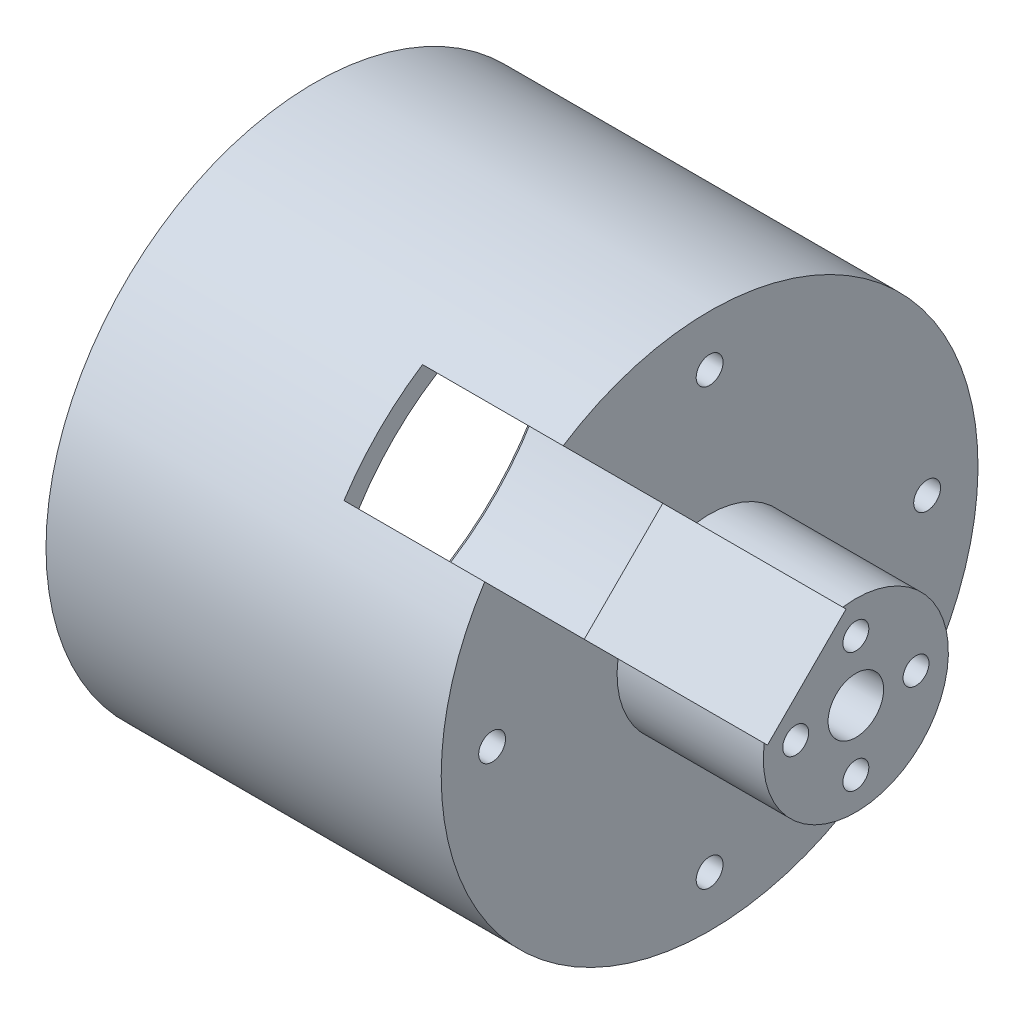
ISO-10303-21;
HEADER;
FILE_DESCRIPTION(('STEP AP214'),'2;1');
FILE_NAME('part.step','',(''),(''),'','','');
FILE_SCHEMA(('AUTOMOTIVE_DESIGN { 1 0 10303 214 1 1 1 1 }'));
ENDSEC;
DATA;
#1=APPLICATION_CONTEXT('core data for automotive mechanical design processes');
#2=APPLICATION_PROTOCOL_DEFINITION('international standard','automotive_design',2000,#1);
#3=PRODUCT_CONTEXT('',#1,'mechanical');
#4=PRODUCT('Part','Part','',(#3));
#5=PRODUCT_RELATED_PRODUCT_CATEGORY('part','',(#4));
#6=PRODUCT_DEFINITION_FORMATION('','',#4);
#7=PRODUCT_DEFINITION_CONTEXT('part definition',#1,'design');
#8=PRODUCT_DEFINITION('design','',#6,#7);
#9=PRODUCT_DEFINITION_SHAPE('','',#8);
#10=(LENGTH_UNIT() NAMED_UNIT(*) SI_UNIT(.MILLI.,.METRE.));
#11=(NAMED_UNIT(*) PLANE_ANGLE_UNIT() SI_UNIT($,.RADIAN.));
#12=(NAMED_UNIT(*) SI_UNIT($,.STERADIAN.) SOLID_ANGLE_UNIT());
#13=UNCERTAINTY_MEASURE_WITH_UNIT(LENGTH_MEASURE(1.E-05),#10,'distance_accuracy_value','');
#14=(GEOMETRIC_REPRESENTATION_CONTEXT(3) GLOBAL_UNCERTAINTY_ASSIGNED_CONTEXT((#13)) GLOBAL_UNIT_ASSIGNED_CONTEXT((#10,
#11,#12)) REPRESENTATION_CONTEXT('',''));
#15=CARTESIAN_POINT('',(0.,0.,0.));
#16=DIRECTION('',(0.,0.,1.));
#17=DIRECTION('',(1.,0.,0.));
#18=AXIS2_PLACEMENT_3D('',#15,#16,#17);
#19=CARTESIAN_POINT('',(-10.123,0.,0.));
#20=DIRECTION('',(-1.,0.,0.));
#21=DIRECTION('',(0.,0.,1.));
#22=AXIS2_PLACEMENT_3D('',#19,#20,#21);
#23=CYLINDRICAL_SURFACE('',#22,26.8);
#24=CARTESIAN_POINT('',(-21.,0.,0.));
#25=DIRECTION('',(1.,0.,0.));
#26=DIRECTION('',(0.,0.,-1.));
#27=AXIS2_PLACEMENT_3D('',#24,#25,#26);
#28=CIRCLE('',#27,26.8);
#29=CARTESIAN_POINT('',(-21.,0.,-26.8));
#30=VERTEX_POINT('',#29);
#31=EDGE_CURVE('E47',#30,#30,#28,.F.);
#32=ORIENTED_EDGE('',*,*,#31,.T.);
#33=EDGE_LOOP('',(#32));
#34=FACE_BOUND('',#33,.T.);
#35=DIRECTION('',(-1.,0.,0.));
#36=VECTOR('',#35,1.);
#37=CARTESIAN_POINT('',(-10.123,22.7120748961036,14.226793521865));
#38=LINE('',#37,#36);
#39=CARTESIAN_POINT('',(6.,22.7120748961036,14.226793521865));
#40=VERTEX_POINT('',#39);
#41=CARTESIAN_POINT('',(17.2,22.7120748961036,14.226793521865));
#42=VERTEX_POINT('',#41);
#43=EDGE_CURVE('E126',#40,#42,#38,.F.);
#44=ORIENTED_EDGE('',*,*,#43,.F.);
#45=CARTESIAN_POINT('',(6.,0.,0.));
#46=DIRECTION('',(-1.,0.,0.));
#47=DIRECTION('',(0.,0.,1.));
#48=AXIS2_PLACEMENT_3D('',#45,#46,#47);
#49=CIRCLE('',#48,26.8);
#50=CARTESIAN_POINT('',(6.,14.226793521865,22.7120748961036));
#51=VERTEX_POINT('',#50);
#52=EDGE_CURVE('E143',#40,#51,#49,.F.);
#53=ORIENTED_EDGE('',*,*,#52,.T.);
#54=DIRECTION('',(-1.,0.,0.));
#55=VECTOR('',#54,1.);
#56=CARTESIAN_POINT('',(-10.123,14.226793521865,22.7120748961036));
#57=LINE('',#56,#55);
#58=CARTESIAN_POINT('',(17.2,14.226793521865,22.7120748961036));
#59=VERTEX_POINT('',#58);
#60=EDGE_CURVE('E120',#59,#51,#57,.T.);
#61=ORIENTED_EDGE('',*,*,#60,.F.);
#62=CARTESIAN_POINT('',(17.2,0.,0.));
#63=DIRECTION('',(-1.,0.,0.));
#64=DIRECTION('',(0.,0.,1.));
#65=AXIS2_PLACEMENT_3D('',#62,#63,#64);
#66=CIRCLE('',#65,26.8);
#67=EDGE_CURVE('E191',#42,#59,#66,.T.);
#68=ORIENTED_EDGE('',*,*,#67,.F.);
#69=EDGE_LOOP('',(#44,#53,#61,#68));
#70=FACE_BOUND('',#69,.T.);
#71=ADVANCED_FACE('F38',(#34,#70),#23,.F.);
#72=CARTESIAN_POINT('',(-10.123,0.,0.));
#73=DIRECTION('',(-1.,0.,0.));
#74=DIRECTION('',(0.,0.,1.));
#75=AXIS2_PLACEMENT_3D('',#72,#73,#74);
#76=CYLINDRICAL_SURFACE('',#75,29.);
#77=CARTESIAN_POINT('',(-21.5,0.,0.));
#78=DIRECTION('',(-1.,0.,0.));
#79=DIRECTION('',(0.,0.,1.));
#80=AXIS2_PLACEMENT_3D('',#77,#78,#79);
#81=CIRCLE('',#80,29.);
#82=CARTESIAN_POINT('',(-21.5,0.,29.));
#83=VERTEX_POINT('',#82);
#84=EDGE_CURVE('E209',#83,#83,#81,.T.);
#85=ORIENTED_EDGE('',*,*,#84,.F.);
#86=EDGE_LOOP('',(#85));
#87=FACE_BOUND('',#86,.T.);
#88=DIRECTION('',(-1.,0.,0.));
#89=VECTOR('',#88,1.);
#90=CARTESIAN_POINT('',(-10.123,24.3050433348582,15.8197619606196));
#91=LINE('',#90,#89);
#92=CARTESIAN_POINT('',(21.2,24.3050433348582,15.8197619606196));
#93=VERTEX_POINT('',#92);
#94=CARTESIAN_POINT('',(6.,24.3050433348582,15.8197619606196));
#95=VERTEX_POINT('',#94);
#96=EDGE_CURVE('E139',#93,#95,#91,.T.);
#97=ORIENTED_EDGE('',*,*,#96,.F.);
#98=CARTESIAN_POINT('',(21.2,0.,0.));
#99=DIRECTION('',(-1.,0.,0.));
#100=DIRECTION('',(0.,0.,1.));
#101=AXIS2_PLACEMENT_3D('',#98,#99,#100);
#102=CIRCLE('',#101,29.);
#103=CARTESIAN_POINT('',(21.2,15.8197619606196,24.3050433348582));
#104=VERTEX_POINT('',#103);
#105=EDGE_CURVE('E125',#93,#104,#102,.T.);
#106=ORIENTED_EDGE('',*,*,#105,.T.);
#107=DIRECTION('',(-1.,0.,0.));
#108=VECTOR('',#107,1.);
#109=CARTESIAN_POINT('',(-10.123,15.8197619606196,24.3050433348582));
#110=LINE('',#109,#108);
#111=CARTESIAN_POINT('',(6.,15.8197619606196,24.3050433348582));
#112=VERTEX_POINT('',#111);
#113=EDGE_CURVE('E117',#112,#104,#110,.F.);
#114=ORIENTED_EDGE('',*,*,#113,.F.);
#115=CARTESIAN_POINT('',(6.,0.,0.));
#116=DIRECTION('',(-1.,0.,0.));
#117=DIRECTION('',(0.,0.,1.));
#118=AXIS2_PLACEMENT_3D('',#115,#116,#117);
#119=CIRCLE('',#118,29.);
#120=EDGE_CURVE('E104',#112,#95,#119,.T.);
#121=ORIENTED_EDGE('',*,*,#120,.T.);
#122=EDGE_LOOP('',(#97,#106,#114,#121));
#123=FACE_BOUND('',#122,.T.);
#124=ADVANCED_FACE('F123',(#87,#123),#76,.T.);
#125=CARTESIAN_POINT('',(21.2,29.,0.));
#126=DIRECTION('',(-1.,0.,0.));
#127=DIRECTION('',(0.,0.,1.));
#128=AXIS2_PLACEMENT_3D('',#125,#126,#127);
#129=PLANE('',#128);
#130=CARTESIAN_POINT('',(21.2,0.,23.5));
#131=DIRECTION('',(1.,0.,0.));
#132=DIRECTION('',(0.,0.,-1.));
#133=AXIS2_PLACEMENT_3D('',#130,#131,#132);
#134=CIRCLE('',#133,1.45);
#135=CARTESIAN_POINT('',(21.2,0.,22.05));
#136=VERTEX_POINT('',#135);
#137=EDGE_CURVE('E173',#136,#136,#134,.T.);
#138=ORIENTED_EDGE('',*,*,#137,.F.);
#139=EDGE_LOOP('',(#138));
#140=FACE_BOUND('',#139,.T.);
#141=CARTESIAN_POINT('',(21.2,23.5,3.33955085807247E-13));
#142=DIRECTION('',(1.,0.,0.));
#143=DIRECTION('',(0.,-1.,0.));
#144=AXIS2_PLACEMENT_3D('',#141,#142,#143);
#145=CIRCLE('',#144,1.45);
#146=CARTESIAN_POINT('',(21.2,22.05,3.18767141983279E-13));
#147=VERTEX_POINT('',#146);
#148=EDGE_CURVE('E167',#147,#147,#145,.T.);
#149=ORIENTED_EDGE('',*,*,#148,.F.);
#150=EDGE_LOOP('',(#149));
#151=FACE_BOUND('',#150,.T.);
#152=CARTESIAN_POINT('',(21.2,0.,-23.5));
#153=DIRECTION('',(1.,0.,0.));
#154=DIRECTION('',(0.,0.,1.));
#155=AXIS2_PLACEMENT_3D('',#152,#153,#154);
#156=CIRCLE('',#155,1.45);
#157=CARTESIAN_POINT('',(21.2,0.,-22.05));
#158=VERTEX_POINT('',#157);
#159=EDGE_CURVE('E180',#158,#158,#156,.T.);
#160=ORIENTED_EDGE('',*,*,#159,.F.);
#161=EDGE_LOOP('',(#160));
#162=FACE_BOUND('',#161,.T.);
#163=CARTESIAN_POINT('',(21.2,-23.5,-1.6985546288162E-13));
#164=DIRECTION('',(1.,0.,0.));
#165=DIRECTION('',(0.,1.,0.));
#166=AXIS2_PLACEMENT_3D('',#163,#164,#165);
#167=CIRCLE('',#166,1.45);
#168=CARTESIAN_POINT('',(21.2,-22.05,-1.64792814940297E-13));
#169=VERTEX_POINT('',#168);
#170=EDGE_CURVE('E174',#169,#169,#167,.T.);
#171=ORIENTED_EDGE('',*,*,#170,.F.);
#172=EDGE_LOOP('',(#171));
#173=FACE_BOUND('',#172,.T.);
#174=DIRECTION('',(0.,0.707106781186548,0.707106781186548));
#175=VECTOR('',#174,1.);
#176=CARTESIAN_POINT('',(21.2,18.7426406871193,10.2573593128807));
#177=LINE('',#176,#175);
#178=CARTESIAN_POINT('',(21.2,9.89949493661167,1.4142135623731));
#179=VERTEX_POINT('',#178);
#180=EDGE_CURVE('E137',#179,#93,#177,.T.);
#181=ORIENTED_EDGE('',*,*,#180,.F.);
#182=CARTESIAN_POINT('',(21.2,0.,0.));
#183=DIRECTION('',(-1.,0.,0.));
#184=DIRECTION('',(0.,0.,1.));
#185=AXIS2_PLACEMENT_3D('',#182,#183,#184);
#186=CIRCLE('',#185,10.);
#187=CARTESIAN_POINT('',(21.2,1.41421356237309,9.89949493661167));
#188=VERTEX_POINT('',#187);
#189=EDGE_CURVE('E205',#179,#188,#186,.T.);
#190=ORIENTED_EDGE('',*,*,#189,.T.);
#191=DIRECTION('',(0.,-0.707106781186548,-0.707106781186547));
#192=VECTOR('',#191,1.);
#193=CARTESIAN_POINT('',(21.2,10.2573593128807,18.7426406871193));
#194=LINE('',#193,#192);
#195=EDGE_CURVE('E127',#104,#188,#194,.T.);
#196=ORIENTED_EDGE('',*,*,#195,.F.);
#197=ORIENTED_EDGE('',*,*,#105,.F.);
#198=EDGE_LOOP('',(#181,#190,#196,#197));
#199=FACE_BOUND('',#198,.T.);
#200=ADVANCED_FACE('F233',(#140,#151,#162,#173,#199),#129,.F.);
#201=CARTESIAN_POINT('',(-10.123,0.,0.));
#202=DIRECTION('',(-1.,0.,0.));
#203=DIRECTION('',(0.,0.,1.));
#204=AXIS2_PLACEMENT_3D('',#201,#202,#203);
#205=CYLINDRICAL_SURFACE('',#204,10.);
#206=DIRECTION('',(-1.,0.,0.));
#207=VECTOR('',#206,1.);
#208=CARTESIAN_POINT('',(-10.123,9.89949493661167,1.4142135623731));
#209=LINE('',#208,#207);
#210=CARTESIAN_POINT('',(37.,9.89949493661167,1.4142135623731));
#211=VERTEX_POINT('',#210);
#212=EDGE_CURVE('E135',#211,#179,#209,.T.);
#213=ORIENTED_EDGE('',*,*,#212,.F.);
#214=CARTESIAN_POINT('',(37.,0.,0.));
#215=DIRECTION('',(-1.,0.,0.));
#216=DIRECTION('',(0.,0.,1.));
#217=AXIS2_PLACEMENT_3D('',#214,#215,#216);
#218=CIRCLE('',#217,10.);
#219=CARTESIAN_POINT('',(37.,1.41421356237309,9.89949493661167));
#220=VERTEX_POINT('',#219);
#221=EDGE_CURVE('E202',#211,#220,#218,.T.);
#222=ORIENTED_EDGE('',*,*,#221,.T.);
#223=DIRECTION('',(-1.,0.,0.));
#224=VECTOR('',#223,1.);
#225=CARTESIAN_POINT('',(-10.123,1.41421356237309,9.89949493661167));
#226=LINE('',#225,#224);
#227=EDGE_CURVE('E54',#188,#220,#226,.F.);
#228=ORIENTED_EDGE('',*,*,#227,.F.);
#229=ORIENTED_EDGE('',*,*,#189,.F.);
#230=EDGE_LOOP('',(#213,#222,#228,#229));
#231=FACE_BOUND('',#230,.T.);
#232=ADVANCED_FACE('F245',(#231),#205,.T.);
#233=CARTESIAN_POINT('',(37.,10.,0.));
#234=DIRECTION('',(-1.,0.,0.));
#235=DIRECTION('',(0.,0.,1.));
#236=AXIS2_PLACEMENT_3D('',#233,#234,#235);
#237=PLANE('',#236);
#238=CARTESIAN_POINT('',(37.,0.,0.));
#239=DIRECTION('',(-1.,0.,0.));
#240=DIRECTION('',(0.,0.,1.));
#241=AXIS2_PLACEMENT_3D('',#238,#239,#240);
#242=CIRCLE('',#241,3.);
#243=CARTESIAN_POINT('',(37.,0.,3.));
#244=VERTEX_POINT('',#243);
#245=EDGE_CURVE('E199',#244,#244,#242,.T.);
#246=ORIENTED_EDGE('',*,*,#245,.T.);
#247=EDGE_LOOP('',(#246));
#248=FACE_BOUND('',#247,.T.);
#249=CARTESIAN_POINT('',(37.,0.,6.5));
#250=DIRECTION('',(1.,0.,0.));
#251=DIRECTION('',(0.,0.,-1.));
#252=AXIS2_PLACEMENT_3D('',#249,#250,#251);
#253=CIRCLE('',#252,1.4);
#254=CARTESIAN_POINT('',(37.,0.,5.1));
#255=VERTEX_POINT('',#254);
#256=EDGE_CURVE('E149',#255,#255,#253,.T.);
#257=ORIENTED_EDGE('',*,*,#256,.F.);
#258=EDGE_LOOP('',(#257));
#259=FACE_BOUND('',#258,.T.);
#260=CARTESIAN_POINT('',(37.,6.5,0.));
#261=DIRECTION('',(1.,0.,0.));
#262=DIRECTION('',(0.,-1.,0.));
#263=AXIS2_PLACEMENT_3D('',#260,#261,#262);
#264=CIRCLE('',#263,1.4);
#265=CARTESIAN_POINT('',(37.,5.1,0.));
#266=VERTEX_POINT('',#265);
#267=EDGE_CURVE('E145',#266,#266,#264,.T.);
#268=ORIENTED_EDGE('',*,*,#267,.F.);
#269=EDGE_LOOP('',(#268));
#270=FACE_BOUND('',#269,.T.);
#271=CARTESIAN_POINT('',(37.,0.,-6.5));
#272=DIRECTION('',(1.,0.,0.));
#273=DIRECTION('',(0.,0.,1.));
#274=AXIS2_PLACEMENT_3D('',#271,#272,#273);
#275=CIRCLE('',#274,1.4);
#276=CARTESIAN_POINT('',(37.,0.,-5.1));
#277=VERTEX_POINT('',#276);
#278=EDGE_CURVE('E156',#277,#277,#275,.T.);
#279=ORIENTED_EDGE('',*,*,#278,.F.);
#280=EDGE_LOOP('',(#279));
#281=FACE_BOUND('',#280,.T.);
#282=CARTESIAN_POINT('',(37.,-6.5,0.));
#283=DIRECTION('',(1.,0.,0.));
#284=DIRECTION('',(0.,1.,0.));
#285=AXIS2_PLACEMENT_3D('',#282,#283,#284);
#286=CIRCLE('',#285,1.4);
#287=CARTESIAN_POINT('',(37.,-5.1,0.));
#288=VERTEX_POINT('',#287);
#289=EDGE_CURVE('E150',#288,#288,#286,.T.);
#290=ORIENTED_EDGE('',*,*,#289,.F.);
#291=EDGE_LOOP('',(#290));
#292=FACE_BOUND('',#291,.T.);
#293=DIRECTION('',(0.,0.707106781186548,0.707106781186548));
#294=VECTOR('',#293,1.);
#295=CARTESIAN_POINT('',(37.,9.24264068711928,0.757359312880718));
#296=LINE('',#295,#294);
#297=CARTESIAN_POINT('',(37.,9.54594154601839,1.06066017177982));
#298=VERTEX_POINT('',#297);
#299=EDGE_CURVE('E129',#298,#211,#296,.T.);
#300=ORIENTED_EDGE('',*,*,#299,.F.);
#301=DIRECTION('',(0.,0.707106781186548,-0.707106781186548));
#302=VECTOR('',#301,1.);
#303=CARTESIAN_POINT('',(37.,10.3033008588991,0.303300858899107));
#304=LINE('',#303,#302);
#305=CARTESIAN_POINT('',(37.,1.06066017177982,9.54594154601839));
#306=VERTEX_POINT('',#305);
#307=EDGE_CURVE('E141',#306,#298,#304,.T.);
#308=ORIENTED_EDGE('',*,*,#307,.F.);
#309=DIRECTION('',(0.,-0.707106781186548,-0.707106781186547));
#310=VECTOR('',#309,1.);
#311=CARTESIAN_POINT('',(37.,0.757359312880715,9.24264068711929));
#312=LINE('',#311,#310);
#313=EDGE_CURVE('E518',#220,#306,#312,.T.);
#314=ORIENTED_EDGE('',*,*,#313,.F.);
#315=ORIENTED_EDGE('',*,*,#221,.F.);
#316=EDGE_LOOP('',(#300,#308,#314,#315));
#317=FACE_BOUND('',#316,.T.);
#318=ADVANCED_FACE('F249',(#248,#259,#270,#281,#292,#317),#237,.F.);
#319=CARTESIAN_POINT('',(17.2,3.,0.));
#320=DIRECTION('',(1.,0.,0.));
#321=DIRECTION('',(0.,0.,-1.));
#322=AXIS2_PLACEMENT_3D('',#319,#320,#321);
#323=PLANE('',#322);
#324=CARTESIAN_POINT('',(17.2,0.,0.));
#325=DIRECTION('',(-1.,0.,0.));
#326=DIRECTION('',(0.,0.,1.));
#327=AXIS2_PLACEMENT_3D('',#324,#325,#326);
#328=CIRCLE('',#327,3.);
#329=CARTESIAN_POINT('',(17.2,0.,3.));
#330=VERTEX_POINT('',#329);
#331=EDGE_CURVE('E196',#330,#330,#328,.T.);
#332=ORIENTED_EDGE('',*,*,#331,.F.);
#333=EDGE_LOOP('',(#332));
#334=FACE_BOUND('',#333,.T.);
#335=CARTESIAN_POINT('',(17.2,0.,23.5));
#336=DIRECTION('',(1.,0.,0.));
#337=DIRECTION('',(0.,0.,-1.));
#338=AXIS2_PLACEMENT_3D('',#335,#336,#337);
#339=CIRCLE('',#338,1.45);
#340=CARTESIAN_POINT('',(17.2,0.,22.05));
#341=VERTEX_POINT('',#340);
#342=EDGE_CURVE('E188',#341,#341,#339,.T.);
#343=ORIENTED_EDGE('',*,*,#342,.T.);
#344=EDGE_LOOP('',(#343));
#345=FACE_BOUND('',#344,.T.);
#346=CARTESIAN_POINT('',(17.2,23.5,3.33955085807247E-13));
#347=DIRECTION('',(1.,0.,0.));
#348=DIRECTION('',(0.,-1.,0.));
#349=AXIS2_PLACEMENT_3D('',#346,#347,#348);
#350=CIRCLE('',#349,1.45);
#351=CARTESIAN_POINT('',(17.2,22.05,3.18767141983279E-13));
#352=VERTEX_POINT('',#351);
#353=EDGE_CURVE('E183',#352,#352,#350,.T.);
#354=ORIENTED_EDGE('',*,*,#353,.T.);
#355=EDGE_LOOP('',(#354));
#356=FACE_BOUND('',#355,.T.);
#357=CARTESIAN_POINT('',(17.2,0.,-23.5));
#358=DIRECTION('',(1.,0.,0.));
#359=DIRECTION('',(0.,0.,1.));
#360=AXIS2_PLACEMENT_3D('',#357,#358,#359);
#361=CIRCLE('',#360,1.45);
#362=CARTESIAN_POINT('',(17.2,0.,-22.05));
#363=VERTEX_POINT('',#362);
#364=EDGE_CURVE('E177',#363,#363,#361,.T.);
#365=ORIENTED_EDGE('',*,*,#364,.T.);
#366=EDGE_LOOP('',(#365));
#367=FACE_BOUND('',#366,.T.);
#368=CARTESIAN_POINT('',(17.2,-23.5,-1.6985546288162E-13));
#369=DIRECTION('',(1.,0.,0.));
#370=DIRECTION('',(0.,1.,0.));
#371=AXIS2_PLACEMENT_3D('',#368,#369,#370);
#372=CIRCLE('',#371,1.45);
#373=CARTESIAN_POINT('',(17.2,-22.05,-1.64792814940297E-13));
#374=VERTEX_POINT('',#373);
#375=EDGE_CURVE('E170',#374,#374,#372,.T.);
#376=ORIENTED_EDGE('',*,*,#375,.T.);
#377=EDGE_LOOP('',(#376));
#378=FACE_BOUND('',#377,.T.);
#379=DIRECTION('',(0.,-0.707106781186548,-0.707106781186548));
#380=VECTOR('',#379,1.);
#381=CARTESIAN_POINT('',(17.2,5.74264068711928,-2.74264068711928));
#382=LINE('',#381,#380);
#383=CARTESIAN_POINT('',(17.2,9.54594154601839,1.06066017177982));
#384=VERTEX_POINT('',#383);
#385=EDGE_CURVE('E114',#42,#384,#382,.T.);
#386=ORIENTED_EDGE('',*,*,#385,.F.);
#387=ORIENTED_EDGE('',*,*,#67,.T.);
#388=DIRECTION('',(0.,0.707106781186548,0.707106781186547));
#389=VECTOR('',#388,1.);
#390=CARTESIAN_POINT('',(17.2,-2.74264068711929,5.74264068711929));
#391=LINE('',#390,#389);
#392=CARTESIAN_POINT('',(17.2,1.06066017177982,9.54594154601839));
#393=VERTEX_POINT('',#392);
#394=EDGE_CURVE('E212',#393,#59,#391,.T.);
#395=ORIENTED_EDGE('',*,*,#394,.F.);
#396=DIRECTION('',(0.,-0.707106781186548,0.707106781186548));
#397=VECTOR('',#396,1.);
#398=CARTESIAN_POINT('',(17.2,6.80330085889911,3.80330085889911));
#399=LINE('',#398,#397);
#400=EDGE_CURVE('E214',#384,#393,#399,.T.);
#401=ORIENTED_EDGE('',*,*,#400,.F.);
#402=EDGE_LOOP('',(#386,#387,#395,#401));
#403=FACE_BOUND('',#402,.T.);
#404=ADVANCED_FACE('F240',(#334,#345,#356,#367,#378,#403),#323,.F.);
#405=CARTESIAN_POINT('',(-21.5,26.8,0.));
#406=DIRECTION('',(1.,0.,0.));
#407=DIRECTION('',(0.,0.,-1.));
#408=AXIS2_PLACEMENT_3D('',#405,#406,#407);
#409=PLANE('',#408);
#410=CARTESIAN_POINT('',(-21.5,0.,0.));
#411=DIRECTION('',(1.,0.,0.));
#412=DIRECTION('',(0.,0.,-1.));
#413=AXIS2_PLACEMENT_3D('',#410,#411,#412);
#414=CIRCLE('',#413,27.3);
#415=CARTESIAN_POINT('',(-21.5,0.,-27.3));
#416=VERTEX_POINT('',#415);
#417=EDGE_CURVE('E11',#416,#416,#414,.T.);
#418=ORIENTED_EDGE('',*,*,#417,.T.);
#419=EDGE_LOOP('',(#418));
#420=FACE_BOUND('',#419,.T.);
#421=ORIENTED_EDGE('',*,*,#84,.T.);
#422=EDGE_LOOP('',(#421));
#423=FACE_BOUND('',#422,.T.);
#424=ADVANCED_FACE('F237',(#420,#423),#409,.F.);
#425=CARTESIAN_POINT('',(-10.123,0.,0.));
#426=DIRECTION('',(-1.,0.,0.));
#427=DIRECTION('',(0.,0.,1.));
#428=AXIS2_PLACEMENT_3D('',#425,#426,#427);
#429=CYLINDRICAL_SURFACE('',#428,3.);
#430=ORIENTED_EDGE('',*,*,#245,.F.);
#431=EDGE_LOOP('',(#430));
#432=FACE_BOUND('',#431,.T.);
#433=ORIENTED_EDGE('',*,*,#331,.T.);
#434=EDGE_LOOP('',(#433));
#435=FACE_BOUND('',#434,.T.);
#436=ADVANCED_FACE('F239',(#432,#435),#429,.F.);
#437=CARTESIAN_POINT('',(17.2,0.,23.5));
#438=DIRECTION('',(1.,0.,0.));
#439=DIRECTION('',(0.,0.,-1.));
#440=AXIS2_PLACEMENT_3D('',#437,#438,#439);
#441=CYLINDRICAL_SURFACE('',#440,1.45);
#442=ORIENTED_EDGE('',*,*,#342,.F.);
#443=EDGE_LOOP('',(#442));
#444=FACE_BOUND('',#443,.T.);
#445=ORIENTED_EDGE('',*,*,#137,.T.);
#446=EDGE_LOOP('',(#445));
#447=FACE_BOUND('',#446,.T.);
#448=ADVANCED_FACE('F256',(#444,#447),#441,.F.);
#449=CARTESIAN_POINT('',(17.2,23.5,3.33955085807247E-13));
#450=DIRECTION('',(1.,0.,0.));
#451=DIRECTION('',(0.,0.,-1.));
#452=AXIS2_PLACEMENT_3D('',#449,#450,#451);
#453=CYLINDRICAL_SURFACE('',#452,1.45);
#454=ORIENTED_EDGE('',*,*,#353,.F.);
#455=EDGE_LOOP('',(#454));
#456=FACE_BOUND('',#455,.T.);
#457=ORIENTED_EDGE('',*,*,#148,.T.);
#458=EDGE_LOOP('',(#457));
#459=FACE_BOUND('',#458,.T.);
#460=ADVANCED_FACE('F263',(#456,#459),#453,.F.);
#461=CARTESIAN_POINT('',(17.2,0.,-23.5));
#462=DIRECTION('',(1.,0.,0.));
#463=DIRECTION('',(0.,0.,-1.));
#464=AXIS2_PLACEMENT_3D('',#461,#462,#463);
#465=CYLINDRICAL_SURFACE('',#464,1.45);
#466=ORIENTED_EDGE('',*,*,#364,.F.);
#467=EDGE_LOOP('',(#466));
#468=FACE_BOUND('',#467,.T.);
#469=ORIENTED_EDGE('',*,*,#159,.T.);
#470=EDGE_LOOP('',(#469));
#471=FACE_BOUND('',#470,.T.);
#472=ADVANCED_FACE('F267',(#468,#471),#465,.F.);
#473=CARTESIAN_POINT('',(17.2,-23.5,-1.6985546288162E-13));
#474=DIRECTION('',(1.,0.,0.));
#475=DIRECTION('',(0.,0.,-1.));
#476=AXIS2_PLACEMENT_3D('',#473,#474,#475);
#477=CYLINDRICAL_SURFACE('',#476,1.45);
#478=ORIENTED_EDGE('',*,*,#375,.F.);
#479=EDGE_LOOP('',(#478));
#480=FACE_BOUND('',#479,.T.);
#481=ORIENTED_EDGE('',*,*,#170,.T.);
#482=EDGE_LOOP('',(#481));
#483=FACE_BOUND('',#482,.T.);
#484=ADVANCED_FACE('F271',(#480,#483),#477,.F.);
#485=CARTESIAN_POINT('',(25.,0.,6.5));
#486=DIRECTION('',(1.,0.,0.));
#487=DIRECTION('',(0.,0.,-1.));
#488=AXIS2_PLACEMENT_3D('',#485,#486,#487);
#489=CYLINDRICAL_SURFACE('',#488,1.4);
#490=CARTESIAN_POINT('',(25.,0.,6.5));
#491=DIRECTION('',(1.,0.,0.));
#492=DIRECTION('',(0.,0.,-1.));
#493=AXIS2_PLACEMENT_3D('',#490,#491,#492);
#494=CIRCLE('',#493,1.4);
#495=CARTESIAN_POINT('',(25.,0.,5.1));
#496=VERTEX_POINT('',#495);
#497=EDGE_CURVE('E164',#496,#496,#494,.T.);
#498=ORIENTED_EDGE('',*,*,#497,.F.);
#499=EDGE_LOOP('',(#498));
#500=FACE_BOUND('',#499,.T.);
#501=ORIENTED_EDGE('',*,*,#256,.T.);
#502=EDGE_LOOP('',(#501));
#503=FACE_BOUND('',#502,.T.);
#504=ADVANCED_FACE('F275',(#500,#503),#489,.F.);
#505=CARTESIAN_POINT('',(25.,0.,6.5));
#506=DIRECTION('',(1.,0.,0.));
#507=DIRECTION('',(0.,0.,-1.));
#508=AXIS2_PLACEMENT_3D('',#505,#506,#507);
#509=PLANE('',#508);
#510=ORIENTED_EDGE('',*,*,#497,.T.);
#511=EDGE_LOOP('',(#510));
#512=FACE_BOUND('',#511,.T.);
#513=ADVANCED_FACE('F279',(#512),#509,.T.);
#514=CARTESIAN_POINT('',(25.,6.5,0.));
#515=DIRECTION('',(1.,0.,0.));
#516=DIRECTION('',(0.,0.,-1.));
#517=AXIS2_PLACEMENT_3D('',#514,#515,#516);
#518=CYLINDRICAL_SURFACE('',#517,1.4);
#519=CARTESIAN_POINT('',(25.,6.5,0.));
#520=DIRECTION('',(1.,0.,0.));
#521=DIRECTION('',(0.,-1.,0.));
#522=AXIS2_PLACEMENT_3D('',#519,#520,#521);
#523=CIRCLE('',#522,1.4);
#524=CARTESIAN_POINT('',(25.,5.1,0.));
#525=VERTEX_POINT('',#524);
#526=EDGE_CURVE('E159',#525,#525,#523,.T.);
#527=ORIENTED_EDGE('',*,*,#526,.F.);
#528=EDGE_LOOP('',(#527));
#529=FACE_BOUND('',#528,.T.);
#530=ORIENTED_EDGE('',*,*,#267,.T.);
#531=EDGE_LOOP('',(#530));
#532=FACE_BOUND('',#531,.T.);
#533=ADVANCED_FACE('F283',(#529,#532),#518,.F.);
#534=CARTESIAN_POINT('',(25.,6.5,0.));
#535=DIRECTION('',(1.,0.,0.));
#536=DIRECTION('',(0.,-1.,0.));
#537=AXIS2_PLACEMENT_3D('',#534,#535,#536);
#538=PLANE('',#537);
#539=ORIENTED_EDGE('',*,*,#526,.T.);
#540=EDGE_LOOP('',(#539));
#541=FACE_BOUND('',#540,.T.);
#542=ADVANCED_FACE('F287',(#541),#538,.T.);
#543=CARTESIAN_POINT('',(25.,0.,-6.5));
#544=DIRECTION('',(1.,0.,0.));
#545=DIRECTION('',(0.,0.,-1.));
#546=AXIS2_PLACEMENT_3D('',#543,#544,#545);
#547=CYLINDRICAL_SURFACE('',#546,1.4);
#548=CARTESIAN_POINT('',(25.,0.,-6.5));
#549=DIRECTION('',(1.,0.,0.));
#550=DIRECTION('',(0.,0.,1.));
#551=AXIS2_PLACEMENT_3D('',#548,#549,#550);
#552=CIRCLE('',#551,1.4);
#553=CARTESIAN_POINT('',(25.,0.,-5.1));
#554=VERTEX_POINT('',#553);
#555=EDGE_CURVE('E153',#554,#554,#552,.T.);
#556=ORIENTED_EDGE('',*,*,#555,.F.);
#557=EDGE_LOOP('',(#556));
#558=FACE_BOUND('',#557,.T.);
#559=ORIENTED_EDGE('',*,*,#278,.T.);
#560=EDGE_LOOP('',(#559));
#561=FACE_BOUND('',#560,.T.);
#562=ADVANCED_FACE('F291',(#558,#561),#547,.F.);
#563=CARTESIAN_POINT('',(25.,0.,-6.5));
#564=DIRECTION('',(1.,0.,0.));
#565=DIRECTION('',(0.,0.,1.));
#566=AXIS2_PLACEMENT_3D('',#563,#564,#565);
#567=PLANE('',#566);
#568=ORIENTED_EDGE('',*,*,#555,.T.);
#569=EDGE_LOOP('',(#568));
#570=FACE_BOUND('',#569,.T.);
#571=ADVANCED_FACE('F295',(#570),#567,.T.);
#572=CARTESIAN_POINT('',(25.,-6.5,0.));
#573=DIRECTION('',(1.,0.,0.));
#574=DIRECTION('',(0.,0.,-1.));
#575=AXIS2_PLACEMENT_3D('',#572,#573,#574);
#576=CYLINDRICAL_SURFACE('',#575,1.4);
#577=CARTESIAN_POINT('',(25.,-6.5,0.));
#578=DIRECTION('',(1.,0.,0.));
#579=DIRECTION('',(0.,1.,0.));
#580=AXIS2_PLACEMENT_3D('',#577,#578,#579);
#581=CIRCLE('',#580,1.4);
#582=CARTESIAN_POINT('',(25.,-5.1,0.));
#583=VERTEX_POINT('',#582);
#584=EDGE_CURVE('E146',#583,#583,#581,.T.);
#585=ORIENTED_EDGE('',*,*,#584,.F.);
#586=EDGE_LOOP('',(#585));
#587=FACE_BOUND('',#586,.T.);
#588=ORIENTED_EDGE('',*,*,#289,.T.);
#589=EDGE_LOOP('',(#588));
#590=FACE_BOUND('',#589,.T.);
#591=ADVANCED_FACE('F299',(#587,#590),#576,.F.);
#592=CARTESIAN_POINT('',(25.,-6.5,0.));
#593=DIRECTION('',(1.,0.,0.));
#594=DIRECTION('',(0.,1.,0.));
#595=AXIS2_PLACEMENT_3D('',#592,#593,#594);
#596=PLANE('',#595);
#597=ORIENTED_EDGE('',*,*,#584,.T.);
#598=EDGE_LOOP('',(#597));
#599=FACE_BOUND('',#598,.T.);
#600=ADVANCED_FACE('F303',(#599),#596,.T.);
#601=CARTESIAN_POINT('',(6.,0.,0.));
#602=DIRECTION('',(-1.,0.,0.));
#603=DIRECTION('',(0.,0.,1.));
#604=AXIS2_PLACEMENT_3D('',#601,#602,#603);
#605=PLANE('',#604);
#606=DIRECTION('',(0.,0.707106781186548,0.707106781186548));
#607=VECTOR('',#606,1.);
#608=CARTESIAN_POINT('',(6.,28.9913780286484,20.5060966544099));
#609=LINE('',#608,#607);
#610=EDGE_CURVE('E110',#40,#95,#609,.T.);
#611=ORIENTED_EDGE('',*,*,#610,.T.);
#612=ORIENTED_EDGE('',*,*,#120,.F.);
#613=DIRECTION('',(0.,-0.707106781186548,-0.707106781186547));
#614=VECTOR('',#613,1.);
#615=CARTESIAN_POINT('',(6.,1.06066017177982,9.54594154601839));
#616=LINE('',#615,#614);
#617=EDGE_CURVE('E107',#112,#51,#616,.T.);
#618=ORIENTED_EDGE('',*,*,#617,.T.);
#619=ORIENTED_EDGE('',*,*,#52,.F.);
#620=EDGE_LOOP('',(#611,#612,#618,#619));
#621=FACE_BOUND('',#620,.T.);
#622=ADVANCED_FACE('F106',(#621),#605,.F.);
#623=CARTESIAN_POINT('',(37.1,9.54594154601839,1.06066017177982));
#624=DIRECTION('',(0.,0.707106781186548,0.707106781186548));
#625=DIRECTION('',(0.,-0.707106781186548,0.707106781186548));
#626=AXIS2_PLACEMENT_3D('',#623,#624,#625);
#627=PLANE('',#626);
#628=ORIENTED_EDGE('',*,*,#307,.T.);
#629=DIRECTION('',(-1.,0.,0.));
#630=VECTOR('',#629,1.);
#631=CARTESIAN_POINT('',(37.1,9.54594154601839,1.06066017177982));
#632=LINE('',#631,#630);
#633=EDGE_CURVE('E522',#298,#384,#632,.T.);
#634=ORIENTED_EDGE('',*,*,#633,.T.);
#635=ORIENTED_EDGE('',*,*,#400,.T.);
#636=DIRECTION('',(-1.,0.,0.));
#637=VECTOR('',#636,1.);
#638=CARTESIAN_POINT('',(37.1,1.06066017177982,9.54594154601839));
#639=LINE('',#638,#637);
#640=EDGE_CURVE('E60',#306,#393,#639,.T.);
#641=ORIENTED_EDGE('',*,*,#640,.F.);
#642=EDGE_LOOP('',(#628,#634,#635,#641));
#643=FACE_BOUND('',#642,.T.);
#644=ADVANCED_FACE('F308',(#643),#627,.T.);
#645=CARTESIAN_POINT('',(37.1,28.9913780286484,20.5060966544099));
#646=DIRECTION('',(0.,-0.707106781186548,0.707106781186548));
#647=DIRECTION('',(0.,-0.707106781186548,-0.707106781186548));
#648=AXIS2_PLACEMENT_3D('',#645,#646,#647);
#649=PLANE('',#648);
#650=ORIENTED_EDGE('',*,*,#96,.T.);
#651=ORIENTED_EDGE('',*,*,#610,.F.);
#652=ORIENTED_EDGE('',*,*,#43,.T.);
#653=ORIENTED_EDGE('',*,*,#385,.T.);
#654=ORIENTED_EDGE('',*,*,#633,.F.);
#655=ORIENTED_EDGE('',*,*,#299,.T.);
#656=ORIENTED_EDGE('',*,*,#212,.T.);
#657=ORIENTED_EDGE('',*,*,#180,.T.);
#658=EDGE_LOOP('',(#650,#651,#652,#653,#654,#655,#656,#657));
#659=FACE_BOUND('',#658,.T.);
#660=ADVANCED_FACE('F226',(#659),#649,.T.);
#661=CARTESIAN_POINT('',(37.1,1.06066017177982,9.54594154601839));
#662=DIRECTION('',(0.,0.707106781186547,-0.707106781186548));
#663=DIRECTION('',(0.,0.707106781186548,0.707106781186547));
#664=AXIS2_PLACEMENT_3D('',#661,#662,#663);
#665=PLANE('',#664);
#666=ORIENTED_EDGE('',*,*,#113,.T.);
#667=ORIENTED_EDGE('',*,*,#195,.T.);
#668=ORIENTED_EDGE('',*,*,#227,.T.);
#669=ORIENTED_EDGE('',*,*,#313,.T.);
#670=ORIENTED_EDGE('',*,*,#640,.T.);
#671=ORIENTED_EDGE('',*,*,#394,.T.);
#672=ORIENTED_EDGE('',*,*,#60,.T.);
#673=ORIENTED_EDGE('',*,*,#617,.F.);
#674=EDGE_LOOP('',(#666,#667,#668,#669,#670,#671,#672,#673));
#675=FACE_BOUND('',#674,.T.);
#676=ADVANCED_FACE('F116',(#675),#665,.T.);
#677=CARTESIAN_POINT('',(-21.,0.,0.));
#678=DIRECTION('',(-1.,0.,0.));
#679=DIRECTION('',(0.,0.,1.));
#680=AXIS2_PLACEMENT_3D('',#677,#678,#679);
#681=CONICAL_SURFACE('',#680,26.8,0.785398163397448);
#682=ORIENTED_EDGE('',*,*,#417,.F.);
#683=EDGE_LOOP('',(#682));
#684=FACE_BOUND('',#683,.T.);
#685=ORIENTED_EDGE('',*,*,#31,.F.);
#686=EDGE_LOOP('',(#685));
#687=FACE_BOUND('',#686,.T.);
#688=ADVANCED_FACE('F41',(#684,#687),#681,.F.);
#689=CLOSED_SHELL('',(#71,#124,#200,#232,#318,#404,#424,#436,#448,#460,#472,#484,#504,#513,#533,
#542,#562,#571,#591,#600,#622,#644,#660,#676,#688));
#690=MANIFOLD_SOLID_BREP('B2',#689);
#691=ADVANCED_BREP_SHAPE_REPRESENTATION('',(#18,#690),#14);
#692=SHAPE_DEFINITION_REPRESENTATION(#9,#691);
ENDSEC;
END-ISO-10303-21;
